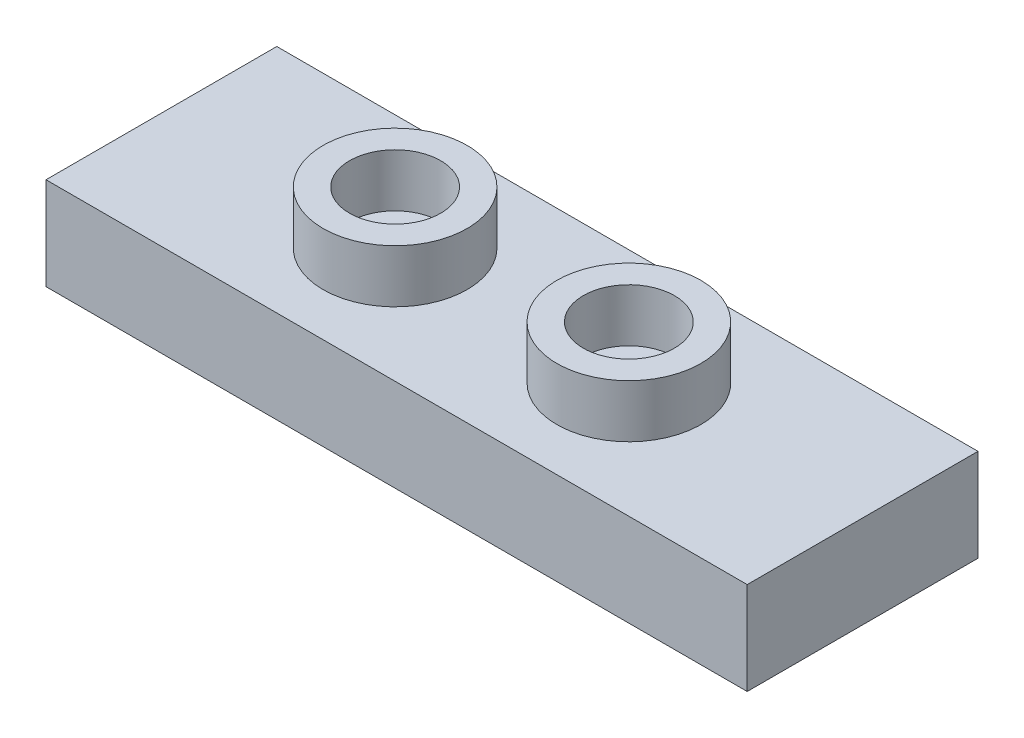
ISO-10303-21;
HEADER;
FILE_DESCRIPTION(('STEP AP214'),'2;1');
FILE_NAME('part.step','',(''),(''),'','','');
FILE_SCHEMA(('AUTOMOTIVE_DESIGN { 1 0 10303 214 1 1 1 1 }'));
ENDSEC;
DATA;
#1=APPLICATION_CONTEXT('core data for automotive mechanical design processes');
#2=APPLICATION_PROTOCOL_DEFINITION('international standard','automotive_design',2000,#1);
#3=PRODUCT_CONTEXT('',#1,'mechanical');
#4=PRODUCT('Part','Part','',(#3));
#5=PRODUCT_RELATED_PRODUCT_CATEGORY('part','',(#4));
#6=PRODUCT_DEFINITION_FORMATION('','',#4);
#7=PRODUCT_DEFINITION_CONTEXT('part definition',#1,'design');
#8=PRODUCT_DEFINITION('design','',#6,#7);
#9=PRODUCT_DEFINITION_SHAPE('','',#8);
#10=(LENGTH_UNIT() NAMED_UNIT(*) SI_UNIT(.MILLI.,.METRE.));
#11=(NAMED_UNIT(*) PLANE_ANGLE_UNIT() SI_UNIT($,.RADIAN.));
#12=(NAMED_UNIT(*) SI_UNIT($,.STERADIAN.) SOLID_ANGLE_UNIT());
#13=UNCERTAINTY_MEASURE_WITH_UNIT(LENGTH_MEASURE(1.E-05),#10,'distance_accuracy_value','');
#14=(GEOMETRIC_REPRESENTATION_CONTEXT(3) GLOBAL_UNCERTAINTY_ASSIGNED_CONTEXT((#13)) GLOBAL_UNIT_ASSIGNED_CONTEXT((#10,
#11,#12)) REPRESENTATION_CONTEXT('',''));
#15=CARTESIAN_POINT('',(0.,0.,0.));
#16=DIRECTION('',(0.,0.,1.));
#17=DIRECTION('',(1.,0.,0.));
#18=AXIS2_PLACEMENT_3D('',#15,#16,#17);
#19=CARTESIAN_POINT('',(11.925,-3.15,-3.925));
#20=DIRECTION('',(1.,0.,0.));
#21=DIRECTION('',(0.,0.,-1.));
#22=AXIS2_PLACEMENT_3D('',#19,#20,#21);
#23=PLANE('',#22);
#24=DIRECTION('',(0.,0.,-1.));
#25=VECTOR('',#24,1.);
#26=CARTESIAN_POINT('',(11.925,0.,-3.925));
#27=LINE('',#26,#25);
#28=CARTESIAN_POINT('',(11.925,0.,3.925));
#29=VERTEX_POINT('',#28);
#30=CARTESIAN_POINT('',(11.925,0.,-3.925));
#31=VERTEX_POINT('',#30);
#32=EDGE_CURVE('E116',#29,#31,#27,.T.);
#33=ORIENTED_EDGE('',*,*,#32,.F.);
#34=DIRECTION('',(0.,1.,0.));
#35=VECTOR('',#34,1.);
#36=CARTESIAN_POINT('',(11.925,-3.15,3.925));
#37=LINE('',#36,#35);
#38=CARTESIAN_POINT('',(11.925,-3.15,3.925));
#39=VERTEX_POINT('',#38);
#40=EDGE_CURVE('E56',#39,#29,#37,.T.);
#41=ORIENTED_EDGE('',*,*,#40,.F.);
#42=DIRECTION('',(0.,0.,-1.));
#43=VECTOR('',#42,1.);
#44=CARTESIAN_POINT('',(11.925,-3.15,-3.925));
#45=LINE('',#44,#43);
#46=CARTESIAN_POINT('',(11.925,-3.15,-3.925));
#47=VERTEX_POINT('',#46);
#48=EDGE_CURVE('E148',#39,#47,#45,.T.);
#49=ORIENTED_EDGE('',*,*,#48,.T.);
#50=DIRECTION('',(0.,1.,0.));
#51=VECTOR('',#50,1.);
#52=CARTESIAN_POINT('',(11.925,-3.15,-3.925));
#53=LINE('',#52,#51);
#54=EDGE_CURVE('E82',#47,#31,#53,.T.);
#55=ORIENTED_EDGE('',*,*,#54,.T.);
#56=EDGE_LOOP('',(#33,#41,#49,#55));
#57=FACE_BOUND('',#56,.T.);
#58=ADVANCED_FACE('F33',(#57),#23,.T.);
#59=CARTESIAN_POINT('',(-11.925,-3.15,3.925));
#60=DIRECTION('',(0.,0.,1.));
#61=DIRECTION('',(1.,0.,0.));
#62=AXIS2_PLACEMENT_3D('',#59,#60,#61);
#63=PLANE('',#62);
#64=DIRECTION('',(1.,0.,0.));
#65=VECTOR('',#64,1.);
#66=CARTESIAN_POINT('',(-11.925,0.,3.925));
#67=LINE('',#66,#65);
#68=CARTESIAN_POINT('',(-11.925,0.,3.925));
#69=VERTEX_POINT('',#68);
#70=EDGE_CURVE('E151',#69,#29,#67,.T.);
#71=ORIENTED_EDGE('',*,*,#70,.F.);
#72=DIRECTION('',(0.,1.,0.));
#73=VECTOR('',#72,1.);
#74=CARTESIAN_POINT('',(-11.925,-3.15,3.925));
#75=LINE('',#74,#73);
#76=CARTESIAN_POINT('',(-11.925,-3.15,3.925));
#77=VERTEX_POINT('',#76);
#78=EDGE_CURVE('E169',#77,#69,#75,.T.);
#79=ORIENTED_EDGE('',*,*,#78,.F.);
#80=DIRECTION('',(1.,0.,0.));
#81=VECTOR('',#80,1.);
#82=CARTESIAN_POINT('',(-11.925,-3.15,3.925));
#83=LINE('',#82,#81);
#84=EDGE_CURVE('E156',#77,#39,#83,.T.);
#85=ORIENTED_EDGE('',*,*,#84,.T.);
#86=ORIENTED_EDGE('',*,*,#40,.T.);
#87=EDGE_LOOP('',(#71,#79,#85,#86));
#88=FACE_BOUND('',#87,.T.);
#89=ADVANCED_FACE('F203',(#88),#63,.T.);
#90=CARTESIAN_POINT('',(-11.925,-3.15,-3.925));
#91=DIRECTION('',(-1.,0.,0.));
#92=DIRECTION('',(0.,0.,1.));
#93=AXIS2_PLACEMENT_3D('',#90,#91,#92);
#94=PLANE('',#93);
#95=DIRECTION('',(0.,0.,1.));
#96=VECTOR('',#95,1.);
#97=CARTESIAN_POINT('',(-11.925,0.,-3.925));
#98=LINE('',#97,#96);
#99=CARTESIAN_POINT('',(-11.925,0.,-3.925));
#100=VERTEX_POINT('',#99);
#101=EDGE_CURVE('E163',#100,#69,#98,.T.);
#102=ORIENTED_EDGE('',*,*,#101,.F.);
#103=DIRECTION('',(0.,1.,0.));
#104=VECTOR('',#103,1.);
#105=CARTESIAN_POINT('',(-11.925,-3.15,-3.925));
#106=LINE('',#105,#104);
#107=CARTESIAN_POINT('',(-11.925,-3.15,-3.925));
#108=VERTEX_POINT('',#107);
#109=EDGE_CURVE('E171',#108,#100,#106,.T.);
#110=ORIENTED_EDGE('',*,*,#109,.F.);
#111=DIRECTION('',(0.,0.,1.));
#112=VECTOR('',#111,1.);
#113=CARTESIAN_POINT('',(-11.925,-3.15,-3.925));
#114=LINE('',#113,#112);
#115=EDGE_CURVE('E153',#108,#77,#114,.T.);
#116=ORIENTED_EDGE('',*,*,#115,.T.);
#117=ORIENTED_EDGE('',*,*,#78,.T.);
#118=EDGE_LOOP('',(#102,#110,#116,#117));
#119=FACE_BOUND('',#118,.T.);
#120=ADVANCED_FACE('F207',(#119),#94,.T.);
#121=CARTESIAN_POINT('',(-11.925,-3.15,-3.925));
#122=DIRECTION('',(0.,0.,-1.));
#123=DIRECTION('',(-1.,0.,0.));
#124=AXIS2_PLACEMENT_3D('',#121,#122,#123);
#125=PLANE('',#124);
#126=DIRECTION('',(-1.,0.,0.));
#127=VECTOR('',#126,1.);
#128=CARTESIAN_POINT('',(-11.925,0.,-3.925));
#129=LINE('',#128,#127);
#130=EDGE_CURVE('E160',#31,#100,#129,.T.);
#131=ORIENTED_EDGE('',*,*,#130,.F.);
#132=ORIENTED_EDGE('',*,*,#54,.F.);
#133=DIRECTION('',(-1.,0.,0.));
#134=VECTOR('',#133,1.);
#135=CARTESIAN_POINT('',(-11.925,-3.15,-3.925));
#136=LINE('',#135,#134);
#137=EDGE_CURVE('E150',#47,#108,#136,.T.);
#138=ORIENTED_EDGE('',*,*,#137,.T.);
#139=ORIENTED_EDGE('',*,*,#109,.T.);
#140=EDGE_LOOP('',(#131,#132,#138,#139));
#141=FACE_BOUND('',#140,.T.);
#142=ADVANCED_FACE('F214',(#141),#125,.T.);
#143=CARTESIAN_POINT('',(0.,-3.15,0.));
#144=DIRECTION('',(0.,1.,0.));
#145=DIRECTION('',(0.,0.,1.));
#146=AXIS2_PLACEMENT_3D('',#143,#144,#145);
#147=PLANE('',#146);
#148=DIRECTION('',(1.,0.,0.));
#149=VECTOR('',#148,1.);
#150=CARTESIAN_POINT('',(0.,-3.15,2.425));
#151=LINE('',#150,#149);
#152=CARTESIAN_POINT('',(-10.425,-3.15,2.425));
#153=VERTEX_POINT('',#152);
#154=CARTESIAN_POINT('',(10.425,-3.15,2.425));
#155=VERTEX_POINT('',#154);
#156=EDGE_CURVE('E143',#153,#155,#151,.T.);
#157=ORIENTED_EDGE('',*,*,#156,.T.);
#158=DIRECTION('',(0.,0.,-1.));
#159=VECTOR('',#158,1.);
#160=CARTESIAN_POINT('',(10.425,-3.15,0.));
#161=LINE('',#160,#159);
#162=CARTESIAN_POINT('',(10.425,-3.15,-2.425));
#163=VERTEX_POINT('',#162);
#164=EDGE_CURVE('E111',#155,#163,#161,.T.);
#165=ORIENTED_EDGE('',*,*,#164,.T.);
#166=DIRECTION('',(-1.,0.,0.));
#167=VECTOR('',#166,1.);
#168=CARTESIAN_POINT('',(0.,-3.15,-2.425));
#169=LINE('',#168,#167);
#170=CARTESIAN_POINT('',(-10.425,-3.15,-2.425));
#171=VERTEX_POINT('',#170);
#172=EDGE_CURVE('E133',#163,#171,#169,.T.);
#173=ORIENTED_EDGE('',*,*,#172,.T.);
#174=DIRECTION('',(0.,0.,1.));
#175=VECTOR('',#174,1.);
#176=CARTESIAN_POINT('',(-10.425,-3.15,0.));
#177=LINE('',#176,#175);
#178=EDGE_CURVE('E47',#171,#153,#177,.T.);
#179=ORIENTED_EDGE('',*,*,#178,.T.);
#180=EDGE_LOOP('',(#157,#165,#173,#179));
#181=FACE_BOUND('',#180,.T.);
#182=ORIENTED_EDGE('',*,*,#48,.F.);
#183=ORIENTED_EDGE('',*,*,#84,.F.);
#184=ORIENTED_EDGE('',*,*,#115,.F.);
#185=ORIENTED_EDGE('',*,*,#137,.F.);
#186=EDGE_LOOP('',(#182,#183,#184,#185));
#187=FACE_BOUND('',#186,.T.);
#188=ADVANCED_FACE('F197',(#181,#187),#147,.F.);
#189=CARTESIAN_POINT('',(0.,0.,0.));
#190=DIRECTION('',(0.,1.,0.));
#191=DIRECTION('',(0.,0.,1.));
#192=AXIS2_PLACEMENT_3D('',#189,#190,#191);
#193=PLANE('',#192);
#194=CARTESIAN_POINT('',(3.975,0.,0.));
#195=DIRECTION('',(0.,1.,0.));
#196=DIRECTION('',(0.,0.,-1.));
#197=AXIS2_PLACEMENT_3D('',#194,#195,#196);
#198=CIRCLE('',#197,2.45);
#199=CARTESIAN_POINT('',(3.975,0.,-2.45));
#200=VERTEX_POINT('',#199);
#201=EDGE_CURVE('E352',#200,#200,#198,.T.);
#202=ORIENTED_EDGE('',*,*,#201,.F.);
#203=EDGE_LOOP('',(#202));
#204=FACE_BOUND('',#203,.T.);
#205=CARTESIAN_POINT('',(-3.975,0.,0.));
#206=DIRECTION('',(0.,1.,0.));
#207=DIRECTION('',(0.,0.,1.));
#208=AXIS2_PLACEMENT_3D('',#205,#206,#207);
#209=CIRCLE('',#208,2.45);
#210=CARTESIAN_POINT('',(-3.975,0.,2.45));
#211=VERTEX_POINT('',#210);
#212=EDGE_CURVE('E363',#211,#211,#209,.T.);
#213=ORIENTED_EDGE('',*,*,#212,.F.);
#214=EDGE_LOOP('',(#213));
#215=FACE_BOUND('',#214,.T.);
#216=ORIENTED_EDGE('',*,*,#32,.T.);
#217=ORIENTED_EDGE('',*,*,#130,.T.);
#218=ORIENTED_EDGE('',*,*,#101,.T.);
#219=ORIENTED_EDGE('',*,*,#70,.T.);
#220=EDGE_LOOP('',(#216,#217,#218,#219));
#221=FACE_BOUND('',#220,.T.);
#222=ADVANCED_FACE('F182',(#204,#215,#221),#193,.T.);
#223=CARTESIAN_POINT('',(10.425,-3.15,-3.925));
#224=DIRECTION('',(1.,0.,0.));
#225=DIRECTION('',(0.,0.,-1.));
#226=AXIS2_PLACEMENT_3D('',#223,#224,#225);
#227=PLANE('',#226);
#228=DIRECTION('',(0.,0.,-1.));
#229=VECTOR('',#228,1.);
#230=CARTESIAN_POINT('',(10.425,-1.5,0.));
#231=LINE('',#230,#229);
#232=CARTESIAN_POINT('',(10.425,-1.5,2.425));
#233=VERTEX_POINT('',#232);
#234=CARTESIAN_POINT('',(10.425,-1.5,-2.425));
#235=VERTEX_POINT('',#234);
#236=EDGE_CURVE('E109',#233,#235,#231,.T.);
#237=ORIENTED_EDGE('',*,*,#236,.T.);
#238=DIRECTION('',(0.,1.,0.));
#239=VECTOR('',#238,1.);
#240=CARTESIAN_POINT('',(10.425,-3.15,-2.425));
#241=LINE('',#240,#239);
#242=EDGE_CURVE('E138',#163,#235,#241,.T.);
#243=ORIENTED_EDGE('',*,*,#242,.F.);
#244=ORIENTED_EDGE('',*,*,#164,.F.);
#245=DIRECTION('',(0.,1.,0.));
#246=VECTOR('',#245,1.);
#247=CARTESIAN_POINT('',(10.425,-3.15,2.425));
#248=LINE('',#247,#246);
#249=EDGE_CURVE('E106',#155,#233,#248,.T.);
#250=ORIENTED_EDGE('',*,*,#249,.T.);
#251=EDGE_LOOP('',(#237,#243,#244,#250));
#252=FACE_BOUND('',#251,.T.);
#253=ADVANCED_FACE('F108',(#252),#227,.F.);
#254=CARTESIAN_POINT('',(-11.925,-3.15,2.425));
#255=DIRECTION('',(0.,0.,1.));
#256=DIRECTION('',(1.,0.,0.));
#257=AXIS2_PLACEMENT_3D('',#254,#255,#256);
#258=PLANE('',#257);
#259=DIRECTION('',(1.,0.,0.));
#260=VECTOR('',#259,1.);
#261=CARTESIAN_POINT('',(0.,-1.5,2.425));
#262=LINE('',#261,#260);
#263=CARTESIAN_POINT('',(-10.425,-1.5,2.425));
#264=VERTEX_POINT('',#263);
#265=EDGE_CURVE('E124',#264,#233,#262,.T.);
#266=ORIENTED_EDGE('',*,*,#265,.T.);
#267=ORIENTED_EDGE('',*,*,#249,.F.);
#268=ORIENTED_EDGE('',*,*,#156,.F.);
#269=DIRECTION('',(0.,1.,0.));
#270=VECTOR('',#269,1.);
#271=CARTESIAN_POINT('',(-10.425,-3.15,2.425));
#272=LINE('',#271,#270);
#273=EDGE_CURVE('E117',#153,#264,#272,.T.);
#274=ORIENTED_EDGE('',*,*,#273,.T.);
#275=EDGE_LOOP('',(#266,#267,#268,#274));
#276=FACE_BOUND('',#275,.T.);
#277=ADVANCED_FACE('F129',(#276),#258,.F.);
#278=CARTESIAN_POINT('',(-10.425,-3.15,-3.925));
#279=DIRECTION('',(-1.,0.,0.));
#280=DIRECTION('',(0.,0.,1.));
#281=AXIS2_PLACEMENT_3D('',#278,#279,#280);
#282=PLANE('',#281);
#283=DIRECTION('',(0.,0.,1.));
#284=VECTOR('',#283,1.);
#285=CARTESIAN_POINT('',(-10.425,-1.5,0.));
#286=LINE('',#285,#284);
#287=CARTESIAN_POINT('',(-10.425,-1.5,-2.425));
#288=VERTEX_POINT('',#287);
#289=EDGE_CURVE('E131',#288,#264,#286,.T.);
#290=ORIENTED_EDGE('',*,*,#289,.T.);
#291=ORIENTED_EDGE('',*,*,#273,.F.);
#292=ORIENTED_EDGE('',*,*,#178,.F.);
#293=DIRECTION('',(0.,1.,0.));
#294=VECTOR('',#293,1.);
#295=CARTESIAN_POINT('',(-10.425,-3.15,-2.425));
#296=LINE('',#295,#294);
#297=EDGE_CURVE('E139',#171,#288,#296,.T.);
#298=ORIENTED_EDGE('',*,*,#297,.T.);
#299=EDGE_LOOP('',(#290,#291,#292,#298));
#300=FACE_BOUND('',#299,.T.);
#301=ADVANCED_FACE('F267',(#300),#282,.F.);
#302=CARTESIAN_POINT('',(-11.925,-3.15,-2.425));
#303=DIRECTION('',(0.,0.,-1.));
#304=DIRECTION('',(-1.,0.,0.));
#305=AXIS2_PLACEMENT_3D('',#302,#303,#304);
#306=PLANE('',#305);
#307=DIRECTION('',(-1.,0.,0.));
#308=VECTOR('',#307,1.);
#309=CARTESIAN_POINT('',(0.,-1.5,-2.425));
#310=LINE('',#309,#308);
#311=EDGE_CURVE('E126',#235,#288,#310,.T.);
#312=ORIENTED_EDGE('',*,*,#311,.T.);
#313=ORIENTED_EDGE('',*,*,#297,.F.);
#314=ORIENTED_EDGE('',*,*,#172,.F.);
#315=ORIENTED_EDGE('',*,*,#242,.T.);
#316=EDGE_LOOP('',(#312,#313,#314,#315));
#317=FACE_BOUND('',#316,.T.);
#318=ADVANCED_FACE('F275',(#317),#306,.F.);
#319=CARTESIAN_POINT('',(0.,-1.5,0.));
#320=DIRECTION('',(0.,1.,0.));
#321=DIRECTION('',(0.,0.,1.));
#322=AXIS2_PLACEMENT_3D('',#319,#320,#321);
#323=PLANE('',#322);
#324=ORIENTED_EDGE('',*,*,#236,.F.);
#325=ORIENTED_EDGE('',*,*,#265,.F.);
#326=ORIENTED_EDGE('',*,*,#289,.F.);
#327=ORIENTED_EDGE('',*,*,#311,.F.);
#328=EDGE_LOOP('',(#324,#325,#326,#327));
#329=FACE_BOUND('',#328,.T.);
#330=ADVANCED_FACE('F122',(#329),#323,.F.);
#331=CARTESIAN_POINT('',(-3.975,1.8,0.));
#332=DIRECTION('',(0.,1.,0.));
#333=DIRECTION('',(0.,0.,1.));
#334=AXIS2_PLACEMENT_3D('',#331,#332,#333);
#335=PLANE('',#334);
#336=CARTESIAN_POINT('',(-3.975,1.8,0.));
#337=DIRECTION('',(0.,1.,0.));
#338=DIRECTION('',(0.,0.,1.));
#339=AXIS2_PLACEMENT_3D('',#336,#337,#338);
#340=CIRCLE('',#339,2.45);
#341=CARTESIAN_POINT('',(-3.975,1.8,2.45));
#342=VERTEX_POINT('',#341);
#343=EDGE_CURVE('E127',#342,#342,#340,.T.);
#344=ORIENTED_EDGE('',*,*,#343,.T.);
#345=EDGE_LOOP('',(#344));
#346=FACE_BOUND('',#345,.T.);
#347=CARTESIAN_POINT('',(-3.975,1.8,0.));
#348=DIRECTION('',(0.,1.,0.));
#349=DIRECTION('',(0.,0.,1.));
#350=AXIS2_PLACEMENT_3D('',#347,#348,#349);
#351=CIRCLE('',#350,1.55);
#352=CARTESIAN_POINT('',(-3.975,1.8,1.55));
#353=VERTEX_POINT('',#352);
#354=EDGE_CURVE('E359',#353,#353,#351,.T.);
#355=ORIENTED_EDGE('',*,*,#354,.F.);
#356=EDGE_LOOP('',(#355));
#357=FACE_BOUND('',#356,.T.);
#358=ADVANCED_FACE('F290',(#346,#357),#335,.T.);
#359=CARTESIAN_POINT('',(-3.975,1.8,0.));
#360=DIRECTION('',(0.,-1.,0.));
#361=DIRECTION('',(0.,0.,-1.));
#362=AXIS2_PLACEMENT_3D('',#359,#360,#361);
#363=CYLINDRICAL_SURFACE('',#362,2.45);
#364=ORIENTED_EDGE('',*,*,#343,.F.);
#365=EDGE_LOOP('',(#364));
#366=FACE_BOUND('',#365,.T.);
#367=ORIENTED_EDGE('',*,*,#212,.T.);
#368=EDGE_LOOP('',(#367));
#369=FACE_BOUND('',#368,.T.);
#370=ADVANCED_FACE('F191',(#366,#369),#363,.T.);
#371=CARTESIAN_POINT('',(-3.975,1.8,0.));
#372=DIRECTION('',(0.,-1.,0.));
#373=DIRECTION('',(0.,0.,-1.));
#374=AXIS2_PLACEMENT_3D('',#371,#372,#373);
#375=CYLINDRICAL_SURFACE('',#374,1.55);
#376=ORIENTED_EDGE('',*,*,#354,.T.);
#377=EDGE_LOOP('',(#376));
#378=FACE_BOUND('',#377,.T.);
#379=CARTESIAN_POINT('',(-3.975,0.,0.));
#380=DIRECTION('',(0.,1.,0.));
#381=DIRECTION('',(0.,0.,1.));
#382=AXIS2_PLACEMENT_3D('',#379,#380,#381);
#383=CIRCLE('',#382,1.55);
#384=CARTESIAN_POINT('',(-3.975,0.,1.55));
#385=VERTEX_POINT('',#384);
#386=EDGE_CURVE('E40',#385,#385,#383,.F.);
#387=ORIENTED_EDGE('',*,*,#386,.T.);
#388=EDGE_LOOP('',(#387));
#389=FACE_BOUND('',#388,.T.);
#390=ADVANCED_FACE('F176',(#378,#389),#375,.F.);
#391=ORIENTED_EDGE('',*,*,#386,.F.);
#392=EDGE_LOOP('',(#391));
#393=FACE_BOUND('',#392,.T.);
#394=ADVANCED_FACE('F178',(#393),#193,.T.);
#395=CARTESIAN_POINT('',(3.975,1.8,0.));
#396=DIRECTION('',(0.,-1.,0.));
#397=DIRECTION('',(0.,0.,-1.));
#398=AXIS2_PLACEMENT_3D('',#395,#396,#397);
#399=PLANE('',#398);
#400=CARTESIAN_POINT('',(3.975,1.8,0.));
#401=DIRECTION('',(0.,1.,0.));
#402=DIRECTION('',(0.,0.,-1.));
#403=AXIS2_PLACEMENT_3D('',#400,#401,#402);
#404=CIRCLE('',#403,2.45);
#405=CARTESIAN_POINT('',(3.975,1.8,-2.45));
#406=VERTEX_POINT('',#405);
#407=EDGE_CURVE('E355',#406,#406,#404,.T.);
#408=ORIENTED_EDGE('',*,*,#407,.T.);
#409=EDGE_LOOP('',(#408));
#410=FACE_BOUND('',#409,.T.);
#411=CARTESIAN_POINT('',(3.975,1.8,0.));
#412=DIRECTION('',(0.,1.,0.));
#413=DIRECTION('',(0.,0.,-1.));
#414=AXIS2_PLACEMENT_3D('',#411,#412,#413);
#415=CIRCLE('',#414,1.55);
#416=CARTESIAN_POINT('',(3.975,1.8,-1.55));
#417=VERTEX_POINT('',#416);
#418=EDGE_CURVE('E349',#417,#417,#415,.T.);
#419=ORIENTED_EDGE('',*,*,#418,.F.);
#420=EDGE_LOOP('',(#419));
#421=FACE_BOUND('',#420,.T.);
#422=ADVANCED_FACE('F180',(#410,#421),#399,.F.);
#423=CARTESIAN_POINT('',(3.975,1.8,0.));
#424=DIRECTION('',(0.,-1.,0.));
#425=DIRECTION('',(0.,0.,-1.));
#426=AXIS2_PLACEMENT_3D('',#423,#424,#425);
#427=CYLINDRICAL_SURFACE('',#426,2.45);
#428=ORIENTED_EDGE('',*,*,#407,.F.);
#429=EDGE_LOOP('',(#428));
#430=FACE_BOUND('',#429,.T.);
#431=ORIENTED_EDGE('',*,*,#201,.T.);
#432=EDGE_LOOP('',(#431));
#433=FACE_BOUND('',#432,.T.);
#434=ADVANCED_FACE('F188',(#430,#433),#427,.T.);
#435=CARTESIAN_POINT('',(3.975,1.8,0.));
#436=DIRECTION('',(0.,-1.,0.));
#437=DIRECTION('',(0.,0.,-1.));
#438=AXIS2_PLACEMENT_3D('',#435,#436,#437);
#439=CYLINDRICAL_SURFACE('',#438,1.55);
#440=ORIENTED_EDGE('',*,*,#418,.T.);
#441=EDGE_LOOP('',(#440));
#442=FACE_BOUND('',#441,.T.);
#443=CARTESIAN_POINT('',(3.975,0.,0.));
#444=DIRECTION('',(0.,1.,0.));
#445=DIRECTION('',(0.,0.,1.));
#446=AXIS2_PLACEMENT_3D('',#443,#444,#445);
#447=CIRCLE('',#446,1.55);
#448=CARTESIAN_POINT('',(3.975,0.,1.55));
#449=VERTEX_POINT('',#448);
#450=EDGE_CURVE('E11',#449,#449,#447,.F.);
#451=ORIENTED_EDGE('',*,*,#450,.T.);
#452=EDGE_LOOP('',(#451));
#453=FACE_BOUND('',#452,.T.);
#454=ADVANCED_FACE('F200',(#442,#453),#439,.F.);
#455=ORIENTED_EDGE('',*,*,#450,.F.);
#456=EDGE_LOOP('',(#455));
#457=FACE_BOUND('',#456,.T.);
#458=ADVANCED_FACE('F183',(#457),#193,.T.);
#459=CLOSED_SHELL('',(#58,#89,#120,#142,#188,#222,#253,#277,#301,#318,#330,#358,#370,#390,#394,
#422,#434,#454,#458));
#460=MANIFOLD_SOLID_BREP('B2',#459);
#461=ADVANCED_BREP_SHAPE_REPRESENTATION('',(#18,#460),#14);
#462=SHAPE_DEFINITION_REPRESENTATION(#9,#461);
ENDSEC;
END-ISO-10303-21;
